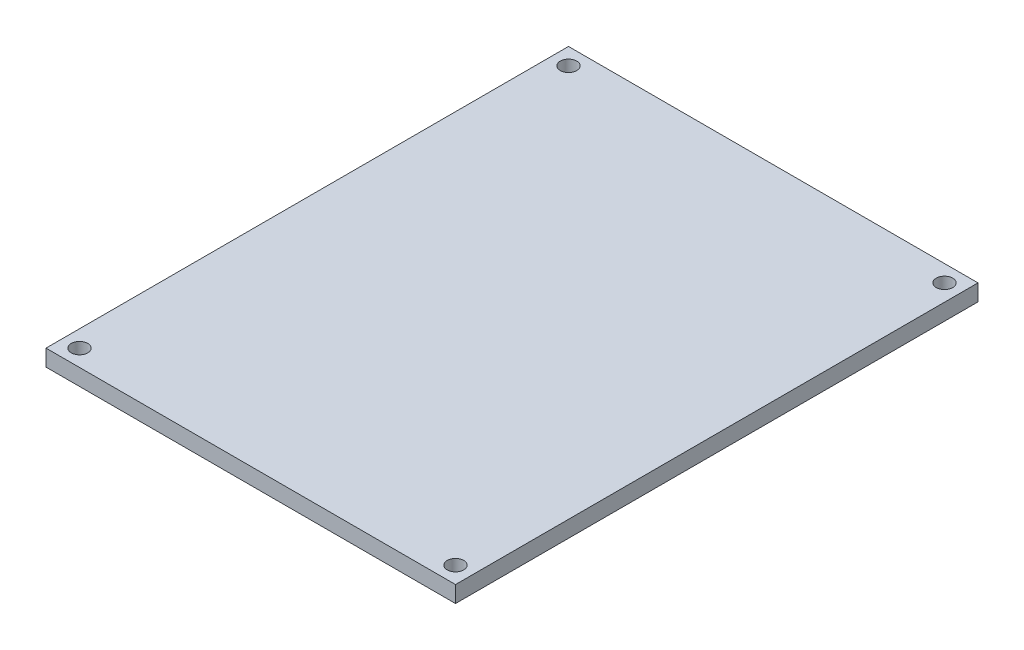
ISO-10303-21;
HEADER;
FILE_DESCRIPTION(('STEP AP214'),'2;1');
FILE_NAME('part.step','',(''),(''),'','','');
FILE_SCHEMA(('AUTOMOTIVE_DESIGN { 1 0 10303 214 1 1 1 1 }'));
ENDSEC;
DATA;
#1=APPLICATION_CONTEXT('core data for automotive mechanical design processes');
#2=APPLICATION_PROTOCOL_DEFINITION('international standard','automotive_design',2000,#1);
#3=PRODUCT_CONTEXT('',#1,'mechanical');
#4=PRODUCT('Part','Part','',(#3));
#5=PRODUCT_RELATED_PRODUCT_CATEGORY('part','',(#4));
#6=PRODUCT_DEFINITION_FORMATION('','',#4);
#7=PRODUCT_DEFINITION_CONTEXT('part definition',#1,'design');
#8=PRODUCT_DEFINITION('design','',#6,#7);
#9=PRODUCT_DEFINITION_SHAPE('','',#8);
#10=(LENGTH_UNIT() NAMED_UNIT(*) SI_UNIT(.MILLI.,.METRE.));
#11=(NAMED_UNIT(*) PLANE_ANGLE_UNIT() SI_UNIT($,.RADIAN.));
#12=(NAMED_UNIT(*) SI_UNIT($,.STERADIAN.) SOLID_ANGLE_UNIT());
#13=UNCERTAINTY_MEASURE_WITH_UNIT(LENGTH_MEASURE(1.E-05),#10,'distance_accuracy_value','');
#14=(GEOMETRIC_REPRESENTATION_CONTEXT(3) GLOBAL_UNCERTAINTY_ASSIGNED_CONTEXT((#13)) GLOBAL_UNIT_ASSIGNED_CONTEXT((#10,
#11,#12)) REPRESENTATION_CONTEXT('',''));
#15=CARTESIAN_POINT('',(0.,0.,0.));
#16=DIRECTION('',(0.,0.,1.));
#17=DIRECTION('',(1.,0.,0.));
#18=AXIS2_PLACEMENT_3D('',#15,#16,#17);
#19=CARTESIAN_POINT('',(0.,3.,0.));
#20=DIRECTION('',(0.,-1.,0.));
#21=DIRECTION('',(0.,0.,-1.));
#22=AXIS2_PLACEMENT_3D('',#19,#20,#21);
#23=PLANE('',#22);
#24=DIRECTION('',(0.,0.,-1.));
#25=VECTOR('',#24,1.);
#26=CARTESIAN_POINT('',(37.28,3.,47.565));
#27=LINE('',#26,#25);
#28=CARTESIAN_POINT('',(37.28,3.,47.565));
#29=VERTEX_POINT('',#28);
#30=CARTESIAN_POINT('',(37.28,3.,-47.565));
#31=VERTEX_POINT('',#30);
#32=EDGE_CURVE('E96',#29,#31,#27,.T.);
#33=ORIENTED_EDGE('',*,*,#32,.T.);
#34=DIRECTION('',(-1.,0.,0.));
#35=VECTOR('',#34,1.);
#36=CARTESIAN_POINT('',(-37.28,3.,-47.565));
#37=LINE('',#36,#35);
#38=CARTESIAN_POINT('',(-37.28,3.,-47.565));
#39=VERTEX_POINT('',#38);
#40=EDGE_CURVE('E91',#31,#39,#37,.T.);
#41=ORIENTED_EDGE('',*,*,#40,.T.);
#42=DIRECTION('',(0.,0.,1.));
#43=VECTOR('',#42,1.);
#44=CARTESIAN_POINT('',(-37.28,3.,47.565));
#45=LINE('',#44,#43);
#46=CARTESIAN_POINT('',(-37.28,3.,47.565));
#47=VERTEX_POINT('',#46);
#48=EDGE_CURVE('E94',#39,#47,#45,.T.);
#49=ORIENTED_EDGE('',*,*,#48,.T.);
#50=DIRECTION('',(1.,0.,0.));
#51=VECTOR('',#50,1.);
#52=CARTESIAN_POINT('',(-37.28,3.,47.565));
#53=LINE('',#52,#51);
#54=EDGE_CURVE('E61',#47,#29,#53,.T.);
#55=ORIENTED_EDGE('',*,*,#54,.T.);
#56=EDGE_LOOP('',(#33,#41,#49,#55));
#57=FACE_BOUND('',#56,.T.);
#58=CARTESIAN_POINT('',(-34.225,3.,-44.515));
#59=DIRECTION('',(0.,1.,0.));
#60=DIRECTION('',(0.,0.,1.));
#61=AXIS2_PLACEMENT_3D('',#58,#59,#60);
#62=CIRCLE('',#61,1.5);
#63=CARTESIAN_POINT('',(-34.225,3.,-43.015));
#64=VERTEX_POINT('',#63);
#65=EDGE_CURVE('E116',#64,#64,#62,.T.);
#66=ORIENTED_EDGE('',*,*,#65,.F.);
#67=EDGE_LOOP('',(#66));
#68=FACE_BOUND('',#67,.T.);
#69=CARTESIAN_POINT('',(34.225,3.,-44.515));
#70=DIRECTION('',(0.,1.,0.));
#71=DIRECTION('',(0.,0.,-1.));
#72=AXIS2_PLACEMENT_3D('',#69,#70,#71);
#73=CIRCLE('',#72,1.5);
#74=CARTESIAN_POINT('',(34.225,3.,-46.015));
#75=VERTEX_POINT('',#74);
#76=EDGE_CURVE('E138',#75,#75,#73,.T.);
#77=ORIENTED_EDGE('',*,*,#76,.F.);
#78=EDGE_LOOP('',(#77));
#79=FACE_BOUND('',#78,.T.);
#80=CARTESIAN_POINT('',(34.225,3.,44.515));
#81=DIRECTION('',(0.,1.,0.));
#82=DIRECTION('',(0.,0.,1.));
#83=AXIS2_PLACEMENT_3D('',#80,#81,#82);
#84=CIRCLE('',#83,1.5);
#85=CARTESIAN_POINT('',(34.225,3.,46.015));
#86=VERTEX_POINT('',#85);
#87=EDGE_CURVE('E146',#86,#86,#84,.T.);
#88=ORIENTED_EDGE('',*,*,#87,.F.);
#89=EDGE_LOOP('',(#88));
#90=FACE_BOUND('',#89,.T.);
#91=CARTESIAN_POINT('',(-34.225,3.,44.515));
#92=DIRECTION('',(0.,1.,0.));
#93=DIRECTION('',(0.,0.,-1.));
#94=AXIS2_PLACEMENT_3D('',#91,#92,#93);
#95=CIRCLE('',#94,1.5);
#96=CARTESIAN_POINT('',(-34.225,3.,43.015));
#97=VERTEX_POINT('',#96);
#98=EDGE_CURVE('E154',#97,#97,#95,.T.);
#99=ORIENTED_EDGE('',*,*,#98,.F.);
#100=EDGE_LOOP('',(#99));
#101=FACE_BOUND('',#100,.T.);
#102=ADVANCED_FACE('F43',(#57,#68,#79,#90,#101),#23,.F.);
#103=CARTESIAN_POINT('',(0.,0.,0.));
#104=DIRECTION('',(0.,-1.,0.));
#105=DIRECTION('',(0.,0.,-1.));
#106=AXIS2_PLACEMENT_3D('',#103,#104,#105);
#107=PLANE('',#106);
#108=CARTESIAN_POINT('',(34.225,0.,44.515));
#109=DIRECTION('',(0.,1.,0.));
#110=DIRECTION('',(0.,0.,1.));
#111=AXIS2_PLACEMENT_3D('',#108,#109,#110);
#112=CIRCLE('',#111,1.5);
#113=CARTESIAN_POINT('',(34.225,0.,46.015));
#114=VERTEX_POINT('',#113);
#115=EDGE_CURVE('E150',#114,#114,#112,.T.);
#116=ORIENTED_EDGE('',*,*,#115,.T.);
#117=EDGE_LOOP('',(#116));
#118=FACE_BOUND('',#117,.T.);
#119=CARTESIAN_POINT('',(-34.225,0.,-44.515));
#120=DIRECTION('',(0.,1.,0.));
#121=DIRECTION('',(0.,0.,1.));
#122=AXIS2_PLACEMENT_3D('',#119,#120,#121);
#123=CIRCLE('',#122,1.5);
#124=CARTESIAN_POINT('',(-34.225,0.,-43.015));
#125=VERTEX_POINT('',#124);
#126=EDGE_CURVE('E134',#125,#125,#123,.T.);
#127=ORIENTED_EDGE('',*,*,#126,.T.);
#128=EDGE_LOOP('',(#127));
#129=FACE_BOUND('',#128,.T.);
#130=DIRECTION('',(0.,0.,-1.));
#131=VECTOR('',#130,1.);
#132=CARTESIAN_POINT('',(37.28,0.,47.565));
#133=LINE('',#132,#131);
#134=CARTESIAN_POINT('',(37.28,0.,47.565));
#135=VERTEX_POINT('',#134);
#136=CARTESIAN_POINT('',(37.28,0.,-47.565));
#137=VERTEX_POINT('',#136);
#138=EDGE_CURVE('E112',#135,#137,#133,.T.);
#139=ORIENTED_EDGE('',*,*,#138,.F.);
#140=DIRECTION('',(1.,0.,0.));
#141=VECTOR('',#140,1.);
#142=CARTESIAN_POINT('',(-37.28,0.,47.565));
#143=LINE('',#142,#141);
#144=CARTESIAN_POINT('',(-37.28,0.,47.565));
#145=VERTEX_POINT('',#144);
#146=EDGE_CURVE('E84',#145,#135,#143,.T.);
#147=ORIENTED_EDGE('',*,*,#146,.F.);
#148=DIRECTION('',(0.,0.,1.));
#149=VECTOR('',#148,1.);
#150=CARTESIAN_POINT('',(-37.28,0.,47.565));
#151=LINE('',#150,#149);
#152=CARTESIAN_POINT('',(-37.28,0.,-47.565));
#153=VERTEX_POINT('',#152);
#154=EDGE_CURVE('E78',#153,#145,#151,.T.);
#155=ORIENTED_EDGE('',*,*,#154,.F.);
#156=DIRECTION('',(-1.,0.,0.));
#157=VECTOR('',#156,1.);
#158=CARTESIAN_POINT('',(-37.28,0.,-47.565));
#159=LINE('',#158,#157);
#160=EDGE_CURVE('E101',#137,#153,#159,.T.);
#161=ORIENTED_EDGE('',*,*,#160,.F.);
#162=EDGE_LOOP('',(#139,#147,#155,#161));
#163=FACE_BOUND('',#162,.T.);
#164=CARTESIAN_POINT('',(34.225,0.,-44.515));
#165=DIRECTION('',(0.,1.,0.));
#166=DIRECTION('',(0.,0.,-1.));
#167=AXIS2_PLACEMENT_3D('',#164,#165,#166);
#168=CIRCLE('',#167,1.5);
#169=CARTESIAN_POINT('',(34.225,0.,-46.015));
#170=VERTEX_POINT('',#169);
#171=EDGE_CURVE('E142',#170,#170,#168,.T.);
#172=ORIENTED_EDGE('',*,*,#171,.T.);
#173=EDGE_LOOP('',(#172));
#174=FACE_BOUND('',#173,.T.);
#175=CARTESIAN_POINT('',(-34.225,0.,44.515));
#176=DIRECTION('',(0.,1.,0.));
#177=DIRECTION('',(0.,0.,-1.));
#178=AXIS2_PLACEMENT_3D('',#175,#176,#177);
#179=CIRCLE('',#178,1.5);
#180=CARTESIAN_POINT('',(-34.225,0.,43.015));
#181=VERTEX_POINT('',#180);
#182=EDGE_CURVE('E158',#181,#181,#179,.T.);
#183=ORIENTED_EDGE('',*,*,#182,.T.);
#184=EDGE_LOOP('',(#183));
#185=FACE_BOUND('',#184,.T.);
#186=ADVANCED_FACE('F129',(#118,#129,#163,#174,#185),#107,.T.);
#187=CARTESIAN_POINT('',(37.28,3.,47.565));
#188=DIRECTION('',(-1.,0.,0.));
#189=DIRECTION('',(0.,0.,1.));
#190=AXIS2_PLACEMENT_3D('',#187,#188,#189);
#191=PLANE('',#190);
#192=ORIENTED_EDGE('',*,*,#138,.T.);
#193=DIRECTION('',(0.,-1.,0.));
#194=VECTOR('',#193,1.);
#195=CARTESIAN_POINT('',(37.28,3.,-47.565));
#196=LINE('',#195,#194);
#197=EDGE_CURVE('E11',#31,#137,#196,.T.);
#198=ORIENTED_EDGE('',*,*,#197,.F.);
#199=ORIENTED_EDGE('',*,*,#32,.F.);
#200=DIRECTION('',(0.,-1.,0.));
#201=VECTOR('',#200,1.);
#202=CARTESIAN_POINT('',(37.28,3.,47.565));
#203=LINE('',#202,#201);
#204=EDGE_CURVE('E108',#29,#135,#203,.T.);
#205=ORIENTED_EDGE('',*,*,#204,.T.);
#206=EDGE_LOOP('',(#192,#198,#199,#205));
#207=FACE_BOUND('',#206,.T.);
#208=ADVANCED_FACE('F45',(#207),#191,.F.);
#209=CARTESIAN_POINT('',(-37.28,3.,-47.565));
#210=DIRECTION('',(0.,0.,1.));
#211=DIRECTION('',(1.,0.,0.));
#212=AXIS2_PLACEMENT_3D('',#209,#210,#211);
#213=PLANE('',#212);
#214=ORIENTED_EDGE('',*,*,#160,.T.);
#215=DIRECTION('',(0.,-1.,0.));
#216=VECTOR('',#215,1.);
#217=CARTESIAN_POINT('',(-37.28,3.,-47.565));
#218=LINE('',#217,#216);
#219=EDGE_CURVE('E53',#39,#153,#218,.T.);
#220=ORIENTED_EDGE('',*,*,#219,.F.);
#221=ORIENTED_EDGE('',*,*,#40,.F.);
#222=ORIENTED_EDGE('',*,*,#197,.T.);
#223=EDGE_LOOP('',(#214,#220,#221,#222));
#224=FACE_BOUND('',#223,.T.);
#225=ADVANCED_FACE('F100',(#224),#213,.F.);
#226=CARTESIAN_POINT('',(-37.28,3.,47.565));
#227=DIRECTION('',(1.,0.,0.));
#228=DIRECTION('',(0.,0.,-1.));
#229=AXIS2_PLACEMENT_3D('',#226,#227,#228);
#230=PLANE('',#229);
#231=ORIENTED_EDGE('',*,*,#154,.T.);
#232=DIRECTION('',(0.,-1.,0.));
#233=VECTOR('',#232,1.);
#234=CARTESIAN_POINT('',(-37.28,3.,47.565));
#235=LINE('',#234,#233);
#236=EDGE_CURVE('E103',#47,#145,#235,.T.);
#237=ORIENTED_EDGE('',*,*,#236,.F.);
#238=ORIENTED_EDGE('',*,*,#48,.F.);
#239=ORIENTED_EDGE('',*,*,#219,.T.);
#240=EDGE_LOOP('',(#231,#237,#238,#239));
#241=FACE_BOUND('',#240,.T.);
#242=ADVANCED_FACE('F104',(#241),#230,.F.);
#243=CARTESIAN_POINT('',(-37.28,3.,47.565));
#244=DIRECTION('',(0.,0.,-1.));
#245=DIRECTION('',(-1.,0.,0.));
#246=AXIS2_PLACEMENT_3D('',#243,#244,#245);
#247=PLANE('',#246);
#248=ORIENTED_EDGE('',*,*,#146,.T.);
#249=ORIENTED_EDGE('',*,*,#204,.F.);
#250=ORIENTED_EDGE('',*,*,#54,.F.);
#251=ORIENTED_EDGE('',*,*,#236,.T.);
#252=EDGE_LOOP('',(#248,#249,#250,#251));
#253=FACE_BOUND('',#252,.T.);
#254=ADVANCED_FACE('F126',(#253),#247,.F.);
#255=CARTESIAN_POINT('',(-34.225,3.,-44.515));
#256=DIRECTION('',(0.,-1.,0.));
#257=DIRECTION('',(0.,0.,-1.));
#258=AXIS2_PLACEMENT_3D('',#255,#256,#257);
#259=CYLINDRICAL_SURFACE('',#258,1.5);
#260=ORIENTED_EDGE('',*,*,#65,.T.);
#261=EDGE_LOOP('',(#260));
#262=FACE_BOUND('',#261,.T.);
#263=ORIENTED_EDGE('',*,*,#126,.F.);
#264=EDGE_LOOP('',(#263));
#265=FACE_BOUND('',#264,.T.);
#266=ADVANCED_FACE('F177',(#262,#265),#259,.F.);
#267=CARTESIAN_POINT('',(34.225,3.,-44.515));
#268=DIRECTION('',(0.,-1.,0.));
#269=DIRECTION('',(0.,0.,-1.));
#270=AXIS2_PLACEMENT_3D('',#267,#268,#269);
#271=CYLINDRICAL_SURFACE('',#270,1.5);
#272=ORIENTED_EDGE('',*,*,#76,.T.);
#273=EDGE_LOOP('',(#272));
#274=FACE_BOUND('',#273,.T.);
#275=ORIENTED_EDGE('',*,*,#171,.F.);
#276=EDGE_LOOP('',(#275));
#277=FACE_BOUND('',#276,.T.);
#278=ADVANCED_FACE('F231',(#274,#277),#271,.F.);
#279=CARTESIAN_POINT('',(34.225,3.,44.515));
#280=DIRECTION('',(0.,-1.,0.));
#281=DIRECTION('',(0.,0.,-1.));
#282=AXIS2_PLACEMENT_3D('',#279,#280,#281);
#283=CYLINDRICAL_SURFACE('',#282,1.5);
#284=ORIENTED_EDGE('',*,*,#87,.T.);
#285=EDGE_LOOP('',(#284));
#286=FACE_BOUND('',#285,.T.);
#287=ORIENTED_EDGE('',*,*,#115,.F.);
#288=EDGE_LOOP('',(#287));
#289=FACE_BOUND('',#288,.T.);
#290=ADVANCED_FACE('F240',(#286,#289),#283,.F.);
#291=CARTESIAN_POINT('',(-34.225,3.,44.515));
#292=DIRECTION('',(0.,-1.,0.));
#293=DIRECTION('',(0.,0.,-1.));
#294=AXIS2_PLACEMENT_3D('',#291,#292,#293);
#295=CYLINDRICAL_SURFACE('',#294,1.5);
#296=ORIENTED_EDGE('',*,*,#98,.T.);
#297=EDGE_LOOP('',(#296));
#298=FACE_BOUND('',#297,.T.);
#299=ORIENTED_EDGE('',*,*,#182,.F.);
#300=EDGE_LOOP('',(#299));
#301=FACE_BOUND('',#300,.T.);
#302=ADVANCED_FACE('F166',(#298,#301),#295,.F.);
#303=CLOSED_SHELL('',(#102,#186,#208,#225,#242,#254,#266,#278,#290,#302));
#304=MANIFOLD_SOLID_BREP('B2',#303);
#305=ADVANCED_BREP_SHAPE_REPRESENTATION('',(#18,#304),#14);
#306=SHAPE_DEFINITION_REPRESENTATION(#9,#305);
ENDSEC;
END-ISO-10303-21;
